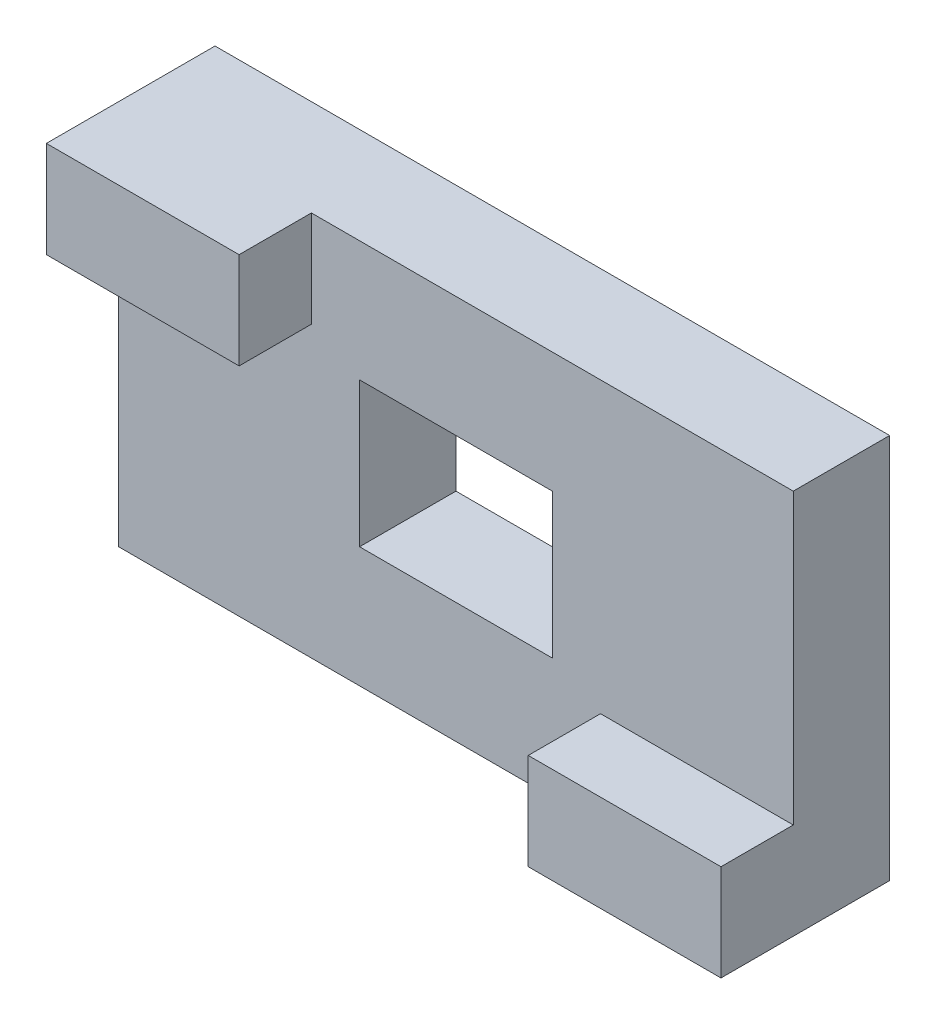
ISO-10303-21;
HEADER;
FILE_DESCRIPTION(('STEP AP214'),'2;1');
FILE_NAME('part.step','',(''),(''),'','','');
FILE_SCHEMA(('AUTOMOTIVE_DESIGN { 1 0 10303 214 1 1 1 1 }'));
ENDSEC;
DATA;
#1=APPLICATION_CONTEXT('core data for automotive mechanical design processes');
#2=APPLICATION_PROTOCOL_DEFINITION('international standard','automotive_design',2000,#1);
#3=PRODUCT_CONTEXT('',#1,'mechanical');
#4=PRODUCT('Part','Part','',(#3));
#5=PRODUCT_RELATED_PRODUCT_CATEGORY('part','',(#4));
#6=PRODUCT_DEFINITION_FORMATION('','',#4);
#7=PRODUCT_DEFINITION_CONTEXT('part definition',#1,'design');
#8=PRODUCT_DEFINITION('design','',#6,#7);
#9=PRODUCT_DEFINITION_SHAPE('','',#8);
#10=(LENGTH_UNIT() NAMED_UNIT(*) SI_UNIT(.MILLI.,.METRE.));
#11=(NAMED_UNIT(*) PLANE_ANGLE_UNIT() SI_UNIT($,.RADIAN.));
#12=(NAMED_UNIT(*) SI_UNIT($,.STERADIAN.) SOLID_ANGLE_UNIT());
#13=UNCERTAINTY_MEASURE_WITH_UNIT(LENGTH_MEASURE(1.E-05),#10,'distance_accuracy_value','');
#14=(GEOMETRIC_REPRESENTATION_CONTEXT(3) GLOBAL_UNCERTAINTY_ASSIGNED_CONTEXT((#13)) GLOBAL_UNIT_ASSIGNED_CONTEXT((#10,
#11,#12)) REPRESENTATION_CONTEXT('',''));
#15=CARTESIAN_POINT('',(0.,0.,0.));
#16=DIRECTION('',(0.,0.,1.));
#17=DIRECTION('',(1.,0.,0.));
#18=AXIS2_PLACEMENT_3D('',#15,#16,#17);
#19=CARTESIAN_POINT('',(0.,0.,4.));
#20=DIRECTION('',(0.,0.,1.));
#21=DIRECTION('',(1.,0.,0.));
#22=AXIS2_PLACEMENT_3D('',#19,#20,#21);
#23=PLANE('',#22);
#24=DIRECTION('',(1.,0.,0.));
#25=VECTOR('',#24,1.);
#26=CARTESIAN_POINT('',(-36.,9.99999999999999,4.));
#27=LINE('',#26,#25);
#28=CARTESIAN_POINT('',(-36.,9.99999999999999,4.));
#29=VERTEX_POINT('',#28);
#30=CARTESIAN_POINT('',(-20.,9.99999999999999,4.));
#31=VERTEX_POINT('',#30);
#32=EDGE_CURVE('E186',#29,#31,#27,.T.);
#33=ORIENTED_EDGE('',*,*,#32,.F.);
#34=DIRECTION('',(0.,-1.,0.));
#35=VECTOR('',#34,1.);
#36=CARTESIAN_POINT('',(-36.,22.,4.));
#37=LINE('',#36,#35);
#38=CARTESIAN_POINT('',(-36.,22.,4.));
#39=VERTEX_POINT('',#38);
#40=EDGE_CURVE('E184',#39,#29,#37,.T.);
#41=ORIENTED_EDGE('',*,*,#40,.F.);
#42=DIRECTION('',(-1.,0.,0.));
#43=VECTOR('',#42,1.);
#44=CARTESIAN_POINT('',(-36.,22.,4.));
#45=LINE('',#44,#43);
#46=CARTESIAN_POINT('',(-20.,22.,4.));
#47=VERTEX_POINT('',#46);
#48=EDGE_CURVE('E192',#47,#39,#45,.T.);
#49=ORIENTED_EDGE('',*,*,#48,.F.);
#50=DIRECTION('',(0.,1.,0.));
#51=VECTOR('',#50,1.);
#52=CARTESIAN_POINT('',(-20.,22.,4.));
#53=LINE('',#52,#51);
#54=EDGE_CURVE('E189',#31,#47,#53,.T.);
#55=ORIENTED_EDGE('',*,*,#54,.F.);
#56=EDGE_LOOP('',(#33,#41,#49,#55));
#57=FACE_BOUND('',#56,.T.);
#58=DIRECTION('',(0.,1.,0.));
#59=VECTOR('',#58,1.);
#60=CARTESIAN_POINT('',(-16.,0.,4.));
#61=LINE('',#60,#59);
#62=CARTESIAN_POINT('',(-16.,0.,4.));
#63=VERTEX_POINT('',#62);
#64=CARTESIAN_POINT('',(-16.,8.,4.));
#65=VERTEX_POINT('',#64);
#66=EDGE_CURVE('E48',#63,#65,#61,.T.);
#67=ORIENTED_EDGE('',*,*,#66,.T.);
#68=DIRECTION('',(1.,0.,0.));
#69=VECTOR('',#68,1.);
#70=CARTESIAN_POINT('',(0.,8.,4.));
#71=LINE('',#70,#69);
#72=CARTESIAN_POINT('',(0.,8.,4.));
#73=VERTEX_POINT('',#72);
#74=EDGE_CURVE('E52',#65,#73,#71,.T.);
#75=ORIENTED_EDGE('',*,*,#74,.T.);
#76=DIRECTION('',(0.,1.,0.));
#77=VECTOR('',#76,1.);
#78=CARTESIAN_POINT('',(0.,0.,4.));
#79=LINE('',#78,#77);
#80=CARTESIAN_POINT('',(0.,32.,4.));
#81=VERTEX_POINT('',#80);
#82=EDGE_CURVE('E152',#73,#81,#79,.T.);
#83=ORIENTED_EDGE('',*,*,#82,.T.);
#84=DIRECTION('',(-1.,0.,0.));
#85=VECTOR('',#84,1.);
#86=CARTESIAN_POINT('',(0.,32.,4.));
#87=LINE('',#86,#85);
#88=CARTESIAN_POINT('',(-40.,32.,4.));
#89=VERTEX_POINT('',#88);
#90=EDGE_CURVE('E216',#81,#89,#87,.T.);
#91=ORIENTED_EDGE('',*,*,#90,.T.);
#92=DIRECTION('',(0.,-1.,0.));
#93=VECTOR('',#92,1.);
#94=CARTESIAN_POINT('',(-40.,0.,4.));
#95=LINE('',#94,#93);
#96=CARTESIAN_POINT('',(-40.,24.,4.));
#97=VERTEX_POINT('',#96);
#98=EDGE_CURVE('E181',#89,#97,#95,.T.);
#99=ORIENTED_EDGE('',*,*,#98,.T.);
#100=DIRECTION('',(-1.,0.,0.));
#101=VECTOR('',#100,1.);
#102=CARTESIAN_POINT('',(0.,24.,4.));
#103=LINE('',#102,#101);
#104=CARTESIAN_POINT('',(-56.,24.,4.));
#105=VERTEX_POINT('',#104);
#106=EDGE_CURVE('E179',#97,#105,#103,.T.);
#107=ORIENTED_EDGE('',*,*,#106,.T.);
#108=DIRECTION('',(0.,-1.,0.));
#109=VECTOR('',#108,1.);
#110=CARTESIAN_POINT('',(-56.,0.,4.));
#111=LINE('',#110,#109);
#112=CARTESIAN_POINT('',(-56.,0.,4.));
#113=VERTEX_POINT('',#112);
#114=EDGE_CURVE('E219',#105,#113,#111,.T.);
#115=ORIENTED_EDGE('',*,*,#114,.T.);
#116=DIRECTION('',(1.,0.,0.));
#117=VECTOR('',#116,1.);
#118=CARTESIAN_POINT('',(0.,0.,4.));
#119=LINE('',#118,#117);
#120=EDGE_CURVE('E221',#113,#63,#119,.T.);
#121=ORIENTED_EDGE('',*,*,#120,.T.);
#122=EDGE_LOOP('',(#67,#75,#83,#91,#99,#107,#115,#121));
#123=FACE_BOUND('',#122,.T.);
#124=ADVANCED_FACE('F33',(#57,#123),#23,.T.);
#125=CARTESIAN_POINT('',(0.,0.,-4.));
#126=DIRECTION('',(0.,0.,1.));
#127=DIRECTION('',(1.,0.,0.));
#128=AXIS2_PLACEMENT_3D('',#125,#126,#127);
#129=PLANE('',#128);
#130=DIRECTION('',(0.,1.,0.));
#131=VECTOR('',#130,1.);
#132=CARTESIAN_POINT('',(0.,0.,-4.));
#133=LINE('',#132,#131);
#134=CARTESIAN_POINT('',(0.,0.,-4.));
#135=VERTEX_POINT('',#134);
#136=CARTESIAN_POINT('',(0.,32.,-4.));
#137=VERTEX_POINT('',#136);
#138=EDGE_CURVE('E214',#135,#137,#133,.T.);
#139=ORIENTED_EDGE('',*,*,#138,.F.);
#140=DIRECTION('',(1.,0.,0.));
#141=VECTOR('',#140,1.);
#142=CARTESIAN_POINT('',(0.,0.,-4.));
#143=LINE('',#142,#141);
#144=CARTESIAN_POINT('',(-56.,0.,-4.));
#145=VERTEX_POINT('',#144);
#146=EDGE_CURVE('E217',#145,#135,#143,.T.);
#147=ORIENTED_EDGE('',*,*,#146,.F.);
#148=DIRECTION('',(0.,-1.,0.));
#149=VECTOR('',#148,1.);
#150=CARTESIAN_POINT('',(-56.,0.,-4.));
#151=LINE('',#150,#149);
#152=CARTESIAN_POINT('',(-56.,32.,-4.));
#153=VERTEX_POINT('',#152);
#154=EDGE_CURVE('E229',#153,#145,#151,.T.);
#155=ORIENTED_EDGE('',*,*,#154,.F.);
#156=DIRECTION('',(-1.,0.,0.));
#157=VECTOR('',#156,1.);
#158=CARTESIAN_POINT('',(0.,32.,-4.));
#159=LINE('',#158,#157);
#160=EDGE_CURVE('E226',#137,#153,#159,.T.);
#161=ORIENTED_EDGE('',*,*,#160,.F.);
#162=EDGE_LOOP('',(#139,#147,#155,#161));
#163=FACE_BOUND('',#162,.T.);
#164=DIRECTION('',(0.,-1.,0.));
#165=VECTOR('',#164,1.);
#166=CARTESIAN_POINT('',(-36.,22.,-4.));
#167=LINE('',#166,#165);
#168=CARTESIAN_POINT('',(-36.,22.,-4.));
#169=VERTEX_POINT('',#168);
#170=CARTESIAN_POINT('',(-36.,9.99999999999999,-4.));
#171=VERTEX_POINT('',#170);
#172=EDGE_CURVE('E183',#169,#171,#167,.T.);
#173=ORIENTED_EDGE('',*,*,#172,.T.);
#174=DIRECTION('',(1.,0.,0.));
#175=VECTOR('',#174,1.);
#176=CARTESIAN_POINT('',(-36.,9.99999999999999,-4.));
#177=LINE('',#176,#175);
#178=CARTESIAN_POINT('',(-20.,9.99999999999999,-4.));
#179=VERTEX_POINT('',#178);
#180=EDGE_CURVE('E197',#171,#179,#177,.T.);
#181=ORIENTED_EDGE('',*,*,#180,.T.);
#182=DIRECTION('',(0.,1.,0.));
#183=VECTOR('',#182,1.);
#184=CARTESIAN_POINT('',(-20.,22.,-4.));
#185=LINE('',#184,#183);
#186=CARTESIAN_POINT('',(-20.,22.,-4.));
#187=VERTEX_POINT('',#186);
#188=EDGE_CURVE('E200',#179,#187,#185,.T.);
#189=ORIENTED_EDGE('',*,*,#188,.T.);
#190=DIRECTION('',(-1.,0.,0.));
#191=VECTOR('',#190,1.);
#192=CARTESIAN_POINT('',(-36.,22.,-4.));
#193=LINE('',#192,#191);
#194=EDGE_CURVE('E187',#187,#169,#193,.T.);
#195=ORIENTED_EDGE('',*,*,#194,.T.);
#196=EDGE_LOOP('',(#173,#181,#189,#195));
#197=FACE_BOUND('',#196,.T.);
#198=ADVANCED_FACE('F250',(#163,#197),#129,.F.);
#199=CARTESIAN_POINT('',(0.,0.,4.));
#200=DIRECTION('',(-1.,0.,0.));
#201=DIRECTION('',(0.,0.,1.));
#202=AXIS2_PLACEMENT_3D('',#199,#200,#201);
#203=PLANE('',#202);
#204=ORIENTED_EDGE('',*,*,#82,.F.);
#205=DIRECTION('',(0.,0.,-1.));
#206=VECTOR('',#205,1.);
#207=CARTESIAN_POINT('',(0.,8.,10.));
#208=LINE('',#207,#206);
#209=CARTESIAN_POINT('',(0.,8.,10.));
#210=VERTEX_POINT('',#209);
#211=EDGE_CURVE('E136',#210,#73,#208,.T.);
#212=ORIENTED_EDGE('',*,*,#211,.F.);
#213=DIRECTION('',(0.,1.,0.));
#214=VECTOR('',#213,1.);
#215=CARTESIAN_POINT('',(0.,0.,10.));
#216=LINE('',#215,#214);
#217=CARTESIAN_POINT('',(0.,0.,10.));
#218=VERTEX_POINT('',#217);
#219=EDGE_CURVE('E142',#218,#210,#216,.T.);
#220=ORIENTED_EDGE('',*,*,#219,.F.);
#221=DIRECTION('',(0.,0.,-1.));
#222=VECTOR('',#221,1.);
#223=CARTESIAN_POINT('',(0.,0.,4.));
#224=LINE('',#223,#222);
#225=EDGE_CURVE('E223',#218,#135,#224,.T.);
#226=ORIENTED_EDGE('',*,*,#225,.T.);
#227=ORIENTED_EDGE('',*,*,#138,.T.);
#228=DIRECTION('',(0.,0.,-1.));
#229=VECTOR('',#228,1.);
#230=CARTESIAN_POINT('',(0.,32.,4.));
#231=LINE('',#230,#229);
#232=EDGE_CURVE('E11',#81,#137,#231,.T.);
#233=ORIENTED_EDGE('',*,*,#232,.F.);
#234=EDGE_LOOP('',(#204,#212,#220,#226,#227,#233));
#235=FACE_BOUND('',#234,.T.);
#236=ADVANCED_FACE('F35',(#235),#203,.F.);
#237=CARTESIAN_POINT('',(0.,32.,4.));
#238=DIRECTION('',(0.,-1.,0.));
#239=DIRECTION('',(1.,0.,0.));
#240=AXIS2_PLACEMENT_3D('',#237,#238,#239);
#241=PLANE('',#240);
#242=DIRECTION('',(0.,0.,-1.));
#243=VECTOR('',#242,1.);
#244=CARTESIAN_POINT('',(-56.,32.,4.));
#245=LINE('',#244,#243);
#246=CARTESIAN_POINT('',(-56.,32.,10.));
#247=VERTEX_POINT('',#246);
#248=EDGE_CURVE('E41',#247,#153,#245,.T.);
#249=ORIENTED_EDGE('',*,*,#248,.F.);
#250=DIRECTION('',(-1.,0.,0.));
#251=VECTOR('',#250,1.);
#252=CARTESIAN_POINT('',(-56.,32.,10.));
#253=LINE('',#252,#251);
#254=CARTESIAN_POINT('',(-40.,32.,10.));
#255=VERTEX_POINT('',#254);
#256=EDGE_CURVE('E167',#255,#247,#253,.T.);
#257=ORIENTED_EDGE('',*,*,#256,.F.);
#258=DIRECTION('',(0.,0.,-1.));
#259=VECTOR('',#258,1.);
#260=CARTESIAN_POINT('',(-40.,32.,10.));
#261=LINE('',#260,#259);
#262=EDGE_CURVE('E170',#255,#89,#261,.T.);
#263=ORIENTED_EDGE('',*,*,#262,.T.);
#264=ORIENTED_EDGE('',*,*,#90,.F.);
#265=ORIENTED_EDGE('',*,*,#232,.T.);
#266=ORIENTED_EDGE('',*,*,#160,.T.);
#267=EDGE_LOOP('',(#249,#257,#263,#264,#265,#266));
#268=FACE_BOUND('',#267,.T.);
#269=ADVANCED_FACE('F245',(#268),#241,.F.);
#270=CARTESIAN_POINT('',(-56.,0.,4.));
#271=DIRECTION('',(1.,0.,0.));
#272=DIRECTION('',(0.,0.,-1.));
#273=AXIS2_PLACEMENT_3D('',#270,#271,#272);
#274=PLANE('',#273);
#275=ORIENTED_EDGE('',*,*,#114,.F.);
#276=DIRECTION('',(0.,0.,-1.));
#277=VECTOR('',#276,1.);
#278=CARTESIAN_POINT('',(-56.,24.,10.));
#279=LINE('',#278,#277);
#280=CARTESIAN_POINT('',(-56.,24.,10.));
#281=VERTEX_POINT('',#280);
#282=EDGE_CURVE('E176',#281,#105,#279,.T.);
#283=ORIENTED_EDGE('',*,*,#282,.F.);
#284=DIRECTION('',(0.,-1.,0.));
#285=VECTOR('',#284,1.);
#286=CARTESIAN_POINT('',(-56.,32.,10.));
#287=LINE('',#286,#285);
#288=EDGE_CURVE('E160',#247,#281,#287,.T.);
#289=ORIENTED_EDGE('',*,*,#288,.F.);
#290=ORIENTED_EDGE('',*,*,#248,.T.);
#291=ORIENTED_EDGE('',*,*,#154,.T.);
#292=DIRECTION('',(0.,0.,-1.));
#293=VECTOR('',#292,1.);
#294=CARTESIAN_POINT('',(-56.,0.,4.));
#295=LINE('',#294,#293);
#296=EDGE_CURVE('E234',#113,#145,#295,.T.);
#297=ORIENTED_EDGE('',*,*,#296,.F.);
#298=EDGE_LOOP('',(#275,#283,#289,#290,#291,#297));
#299=FACE_BOUND('',#298,.T.);
#300=ADVANCED_FACE('F239',(#299),#274,.F.);
#301=CARTESIAN_POINT('',(0.,0.,4.));
#302=DIRECTION('',(0.,1.,0.));
#303=DIRECTION('',(0.,0.,1.));
#304=AXIS2_PLACEMENT_3D('',#301,#302,#303);
#305=PLANE('',#304);
#306=ORIENTED_EDGE('',*,*,#225,.F.);
#307=DIRECTION('',(1.,0.,0.));
#308=VECTOR('',#307,1.);
#309=CARTESIAN_POINT('',(0.,0.,10.));
#310=LINE('',#309,#308);
#311=CARTESIAN_POINT('',(-16.,0.,10.));
#312=VERTEX_POINT('',#311);
#313=EDGE_CURVE('E148',#312,#218,#310,.T.);
#314=ORIENTED_EDGE('',*,*,#313,.F.);
#315=DIRECTION('',(0.,0.,-1.));
#316=VECTOR('',#315,1.);
#317=CARTESIAN_POINT('',(-16.,0.,10.));
#318=LINE('',#317,#316);
#319=EDGE_CURVE('E155',#312,#63,#318,.T.);
#320=ORIENTED_EDGE('',*,*,#319,.T.);
#321=ORIENTED_EDGE('',*,*,#120,.F.);
#322=ORIENTED_EDGE('',*,*,#296,.T.);
#323=ORIENTED_EDGE('',*,*,#146,.T.);
#324=EDGE_LOOP('',(#306,#314,#320,#321,#322,#323));
#325=FACE_BOUND('',#324,.T.);
#326=ADVANCED_FACE('F253',(#325),#305,.F.);
#327=CARTESIAN_POINT('',(-36.,22.,4.));
#328=DIRECTION('',(1.,0.,0.));
#329=DIRECTION('',(0.,0.,-1.));
#330=AXIS2_PLACEMENT_3D('',#327,#328,#329);
#331=PLANE('',#330);
#332=ORIENTED_EDGE('',*,*,#172,.F.);
#333=DIRECTION('',(0.,0.,-1.));
#334=VECTOR('',#333,1.);
#335=CARTESIAN_POINT('',(-36.,22.,4.));
#336=LINE('',#335,#334);
#337=EDGE_CURVE('E194',#39,#169,#336,.T.);
#338=ORIENTED_EDGE('',*,*,#337,.F.);
#339=ORIENTED_EDGE('',*,*,#40,.T.);
#340=DIRECTION('',(0.,0.,-1.));
#341=VECTOR('',#340,1.);
#342=CARTESIAN_POINT('',(-36.,9.99999999999999,4.));
#343=LINE('',#342,#341);
#344=EDGE_CURVE('E211',#29,#171,#343,.T.);
#345=ORIENTED_EDGE('',*,*,#344,.T.);
#346=EDGE_LOOP('',(#332,#338,#339,#345));
#347=FACE_BOUND('',#346,.T.);
#348=ADVANCED_FACE('F276',(#347),#331,.T.);
#349=CARTESIAN_POINT('',(-36.,9.99999999999999,4.));
#350=DIRECTION('',(0.,1.,0.));
#351=DIRECTION('',(0.,0.,1.));
#352=AXIS2_PLACEMENT_3D('',#349,#350,#351);
#353=PLANE('',#352);
#354=ORIENTED_EDGE('',*,*,#180,.F.);
#355=ORIENTED_EDGE('',*,*,#344,.F.);
#356=ORIENTED_EDGE('',*,*,#32,.T.);
#357=DIRECTION('',(0.,0.,-1.));
#358=VECTOR('',#357,1.);
#359=CARTESIAN_POINT('',(-20.,9.99999999999999,4.));
#360=LINE('',#359,#358);
#361=EDGE_CURVE('E209',#31,#179,#360,.T.);
#362=ORIENTED_EDGE('',*,*,#361,.T.);
#363=EDGE_LOOP('',(#354,#355,#356,#362));
#364=FACE_BOUND('',#363,.T.);
#365=ADVANCED_FACE('F302',(#364),#353,.T.);
#366=CARTESIAN_POINT('',(-20.,22.,4.));
#367=DIRECTION('',(-1.,0.,0.));
#368=DIRECTION('',(0.,-1.,0.));
#369=AXIS2_PLACEMENT_3D('',#366,#367,#368);
#370=PLANE('',#369);
#371=ORIENTED_EDGE('',*,*,#188,.F.);
#372=ORIENTED_EDGE('',*,*,#361,.F.);
#373=ORIENTED_EDGE('',*,*,#54,.T.);
#374=DIRECTION('',(0.,0.,-1.));
#375=VECTOR('',#374,1.);
#376=CARTESIAN_POINT('',(-20.,22.,4.));
#377=LINE('',#376,#375);
#378=EDGE_CURVE('E207',#47,#187,#377,.T.);
#379=ORIENTED_EDGE('',*,*,#378,.T.);
#380=EDGE_LOOP('',(#371,#372,#373,#379));
#381=FACE_BOUND('',#380,.T.);
#382=ADVANCED_FACE('F312',(#381),#370,.T.);
#383=CARTESIAN_POINT('',(-36.,22.,4.));
#384=DIRECTION('',(0.,-1.,0.));
#385=DIRECTION('',(1.,0.,0.));
#386=AXIS2_PLACEMENT_3D('',#383,#384,#385);
#387=PLANE('',#386);
#388=ORIENTED_EDGE('',*,*,#194,.F.);
#389=ORIENTED_EDGE('',*,*,#378,.F.);
#390=ORIENTED_EDGE('',*,*,#48,.T.);
#391=ORIENTED_EDGE('',*,*,#337,.T.);
#392=EDGE_LOOP('',(#388,#389,#390,#391));
#393=FACE_BOUND('',#392,.T.);
#394=ADVANCED_FACE('F321',(#393),#387,.T.);
#395=CARTESIAN_POINT('',(-56.,24.,10.));
#396=DIRECTION('',(0.,1.,0.));
#397=DIRECTION('',(0.,0.,1.));
#398=AXIS2_PLACEMENT_3D('',#395,#396,#397);
#399=PLANE('',#398);
#400=ORIENTED_EDGE('',*,*,#106,.F.);
#401=DIRECTION('',(0.,0.,-1.));
#402=VECTOR('',#401,1.);
#403=CARTESIAN_POINT('',(-40.,24.,10.));
#404=LINE('',#403,#402);
#405=CARTESIAN_POINT('',(-40.,24.,10.));
#406=VERTEX_POINT('',#405);
#407=EDGE_CURVE('E173',#406,#97,#404,.T.);
#408=ORIENTED_EDGE('',*,*,#407,.F.);
#409=DIRECTION('',(1.,0.,0.));
#410=VECTOR('',#409,1.);
#411=CARTESIAN_POINT('',(-56.,24.,10.));
#412=LINE('',#411,#410);
#413=EDGE_CURVE('E163',#281,#406,#412,.T.);
#414=ORIENTED_EDGE('',*,*,#413,.F.);
#415=ORIENTED_EDGE('',*,*,#282,.T.);
#416=EDGE_LOOP('',(#400,#408,#414,#415));
#417=FACE_BOUND('',#416,.T.);
#418=ADVANCED_FACE('F258',(#417),#399,.F.);
#419=CARTESIAN_POINT('',(-40.,32.,10.));
#420=DIRECTION('',(-1.,0.,0.));
#421=DIRECTION('',(0.,0.,1.));
#422=AXIS2_PLACEMENT_3D('',#419,#420,#421);
#423=PLANE('',#422);
#424=ORIENTED_EDGE('',*,*,#98,.F.);
#425=ORIENTED_EDGE('',*,*,#262,.F.);
#426=DIRECTION('',(0.,1.,0.));
#427=VECTOR('',#426,1.);
#428=CARTESIAN_POINT('',(-40.,32.,10.));
#429=LINE('',#428,#427);
#430=EDGE_CURVE('E165',#406,#255,#429,.T.);
#431=ORIENTED_EDGE('',*,*,#430,.F.);
#432=ORIENTED_EDGE('',*,*,#407,.T.);
#433=EDGE_LOOP('',(#424,#425,#431,#432));
#434=FACE_BOUND('',#433,.T.);
#435=ADVANCED_FACE('F266',(#434),#423,.F.);
#436=CARTESIAN_POINT('',(0.,0.,10.));
#437=DIRECTION('',(0.,0.,1.));
#438=DIRECTION('',(1.,0.,0.));
#439=AXIS2_PLACEMENT_3D('',#436,#437,#438);
#440=PLANE('',#439);
#441=ORIENTED_EDGE('',*,*,#288,.T.);
#442=ORIENTED_EDGE('',*,*,#413,.T.);
#443=ORIENTED_EDGE('',*,*,#430,.T.);
#444=ORIENTED_EDGE('',*,*,#256,.T.);
#445=EDGE_LOOP('',(#441,#442,#443,#444));
#446=FACE_BOUND('',#445,.T.);
#447=ADVANCED_FACE('F262',(#446),#440,.T.);
#448=CARTESIAN_POINT('',(0.,8.,10.));
#449=DIRECTION('',(0.,-1.,0.));
#450=DIRECTION('',(1.,0.,0.));
#451=AXIS2_PLACEMENT_3D('',#448,#449,#450);
#452=PLANE('',#451);
#453=ORIENTED_EDGE('',*,*,#74,.F.);
#454=DIRECTION('',(0.,0.,-1.));
#455=VECTOR('',#454,1.);
#456=CARTESIAN_POINT('',(-16.,8.,10.));
#457=LINE('',#456,#455);
#458=CARTESIAN_POINT('',(-16.,8.,10.));
#459=VERTEX_POINT('',#458);
#460=EDGE_CURVE('E138',#459,#65,#457,.T.);
#461=ORIENTED_EDGE('',*,*,#460,.F.);
#462=DIRECTION('',(-1.,0.,0.));
#463=VECTOR('',#462,1.);
#464=CARTESIAN_POINT('',(0.,8.,10.));
#465=LINE('',#464,#463);
#466=EDGE_CURVE('E132',#210,#459,#465,.T.);
#467=ORIENTED_EDGE('',*,*,#466,.F.);
#468=ORIENTED_EDGE('',*,*,#211,.T.);
#469=EDGE_LOOP('',(#453,#461,#467,#468));
#470=FACE_BOUND('',#469,.T.);
#471=ADVANCED_FACE('F134',(#470),#452,.F.);
#472=CARTESIAN_POINT('',(-16.,0.,10.));
#473=DIRECTION('',(1.,0.,0.));
#474=DIRECTION('',(0.,0.,-1.));
#475=AXIS2_PLACEMENT_3D('',#472,#473,#474);
#476=PLANE('',#475);
#477=ORIENTED_EDGE('',*,*,#66,.F.);
#478=ORIENTED_EDGE('',*,*,#319,.F.);
#479=DIRECTION('',(0.,-1.,0.));
#480=VECTOR('',#479,1.);
#481=CARTESIAN_POINT('',(-16.,0.,10.));
#482=LINE('',#481,#480);
#483=EDGE_CURVE('E141',#459,#312,#482,.T.);
#484=ORIENTED_EDGE('',*,*,#483,.F.);
#485=ORIENTED_EDGE('',*,*,#460,.T.);
#486=EDGE_LOOP('',(#477,#478,#484,#485));
#487=FACE_BOUND('',#486,.T.);
#488=ADVANCED_FACE('F392',(#487),#476,.F.);
#489=CARTESIAN_POINT('',(0.,0.,10.));
#490=DIRECTION('',(0.,0.,1.));
#491=DIRECTION('',(1.,0.,0.));
#492=AXIS2_PLACEMENT_3D('',#489,#490,#491);
#493=PLANE('',#492);
#494=ORIENTED_EDGE('',*,*,#219,.T.);
#495=ORIENTED_EDGE('',*,*,#466,.T.);
#496=ORIENTED_EDGE('',*,*,#483,.T.);
#497=ORIENTED_EDGE('',*,*,#313,.T.);
#498=EDGE_LOOP('',(#494,#495,#496,#497));
#499=FACE_BOUND('',#498,.T.);
#500=ADVANCED_FACE('F146',(#499),#493,.T.);
#501=CLOSED_SHELL('',(#124,#198,#236,#269,#300,#326,#348,#365,#382,#394,#418,#435,#447,#471,
#488,#500));
#502=MANIFOLD_SOLID_BREP('B2',#501);
#503=ADVANCED_BREP_SHAPE_REPRESENTATION('',(#18,#502),#14);
#504=SHAPE_DEFINITION_REPRESENTATION(#9,#503);
ENDSEC;
END-ISO-10303-21;
